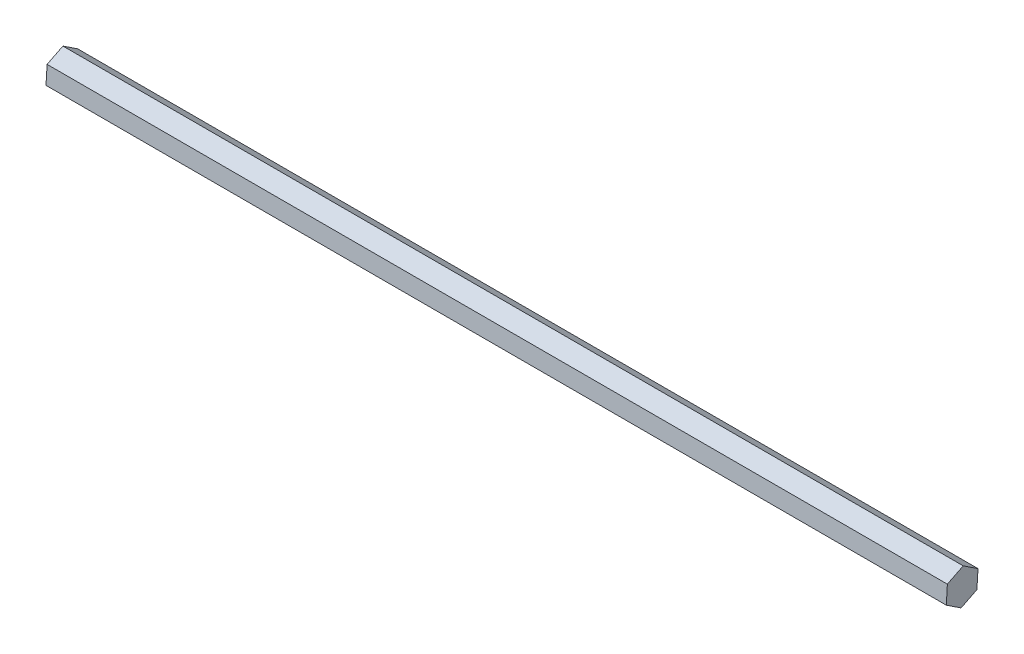
ISO-10303-21;
HEADER;
FILE_DESCRIPTION(('STEP AP214'),'2;1');
FILE_NAME('part.step','',(''),(''),'','','');
FILE_SCHEMA(('AUTOMOTIVE_DESIGN { 1 0 10303 214 1 1 1 1 }'));
ENDSEC;
DATA;
#1=APPLICATION_CONTEXT('core data for automotive mechanical design processes');
#2=APPLICATION_PROTOCOL_DEFINITION('international standard','automotive_design',2000,#1);
#3=PRODUCT_CONTEXT('',#1,'mechanical');
#4=PRODUCT('Part','Part','',(#3));
#5=PRODUCT_RELATED_PRODUCT_CATEGORY('part','',(#4));
#6=PRODUCT_DEFINITION_FORMATION('','',#4);
#7=PRODUCT_DEFINITION_CONTEXT('part definition',#1,'design');
#8=PRODUCT_DEFINITION('design','',#6,#7);
#9=PRODUCT_DEFINITION_SHAPE('','',#8);
#10=(LENGTH_UNIT() NAMED_UNIT(*) SI_UNIT(.MILLI.,.METRE.));
#11=(NAMED_UNIT(*) PLANE_ANGLE_UNIT() SI_UNIT($,.RADIAN.));
#12=(NAMED_UNIT(*) SI_UNIT($,.STERADIAN.) SOLID_ANGLE_UNIT());
#13=UNCERTAINTY_MEASURE_WITH_UNIT(LENGTH_MEASURE(1.E-05),#10,'distance_accuracy_value','');
#14=(GEOMETRIC_REPRESENTATION_CONTEXT(3) GLOBAL_UNCERTAINTY_ASSIGNED_CONTEXT((#13)) GLOBAL_UNIT_ASSIGNED_CONTEXT((#10,
#11,#12)) REPRESENTATION_CONTEXT('',''));
#15=CARTESIAN_POINT('',(0.,0.,0.));
#16=DIRECTION('',(0.,0.,1.));
#17=DIRECTION('',(1.,0.,0.));
#18=AXIS2_PLACEMENT_3D('',#15,#16,#17);
#19=CARTESIAN_POINT('',(381.,-7.48245422088217,0.457285098297222));
#20=DIRECTION('',(0.,0.894912889203078,0.44624087748457));
#21=DIRECTION('',(0.,-0.44624087748457,0.894912889203078));
#22=AXIS2_PLACEMENT_3D('',#19,#20,#21);
#23=PLANE('',#22);
#24=DIRECTION('',(0.,0.44624087748457,-0.894912889203078));
#25=VECTOR('',#24,1.);
#26=CARTESIAN_POINT('',(0.,-7.48245422088217,0.457285098297222));
#27=LINE('',#26,#25);
#28=CARTESIAN_POINT('',(0.,-7.48245422088217,0.457285098297222));
#29=VERTEX_POINT('',#28);
#30=CARTESIAN_POINT('',(0.,-4.13724762233855,-6.25135288878945));
#31=VERTEX_POINT('',#30);
#32=EDGE_CURVE('E117',#29,#31,#27,.T.);
#33=ORIENTED_EDGE('',*,*,#32,.T.);
#34=DIRECTION('',(-1.,0.,0.));
#35=VECTOR('',#34,1.);
#36=CARTESIAN_POINT('',(381.,-4.13724762233855,-6.25135288878945));
#37=LINE('',#36,#35);
#38=CARTESIAN_POINT('',(381.,-4.13724762233855,-6.25135288878945));
#39=VERTEX_POINT('',#38);
#40=EDGE_CURVE('E11',#39,#31,#37,.T.);
#41=ORIENTED_EDGE('',*,*,#40,.F.);
#42=DIRECTION('',(0.,0.44624087748457,-0.894912889203078));
#43=VECTOR('',#42,1.);
#44=CARTESIAN_POINT('',(381.,-7.48245422088217,0.457285098297222));
#45=LINE('',#44,#43);
#46=CARTESIAN_POINT('',(381.,-7.48245422088217,0.457285098297222));
#47=VERTEX_POINT('',#46);
#48=EDGE_CURVE('E127',#47,#39,#45,.T.);
#49=ORIENTED_EDGE('',*,*,#48,.F.);
#50=DIRECTION('',(-1.,0.,0.));
#51=VECTOR('',#50,1.);
#52=CARTESIAN_POINT('',(381.,-7.48245422088217,0.457285098297222));
#53=LINE('',#52,#51);
#54=EDGE_CURVE('E113',#47,#29,#53,.T.);
#55=ORIENTED_EDGE('',*,*,#54,.T.);
#56=EDGE_LOOP('',(#33,#41,#49,#55));
#57=FACE_BOUND('',#56,.T.);
#58=ADVANCED_FACE('F33',(#57),#23,.F.);
#59=CARTESIAN_POINT('',(381.,-4.13724762233855,-6.25135288878945));
#60=DIRECTION('',(0.,0.061000508492842,0.998137734966279));
#61=DIRECTION('',(0.,-0.998137734966279,0.061000508492842));
#62=AXIS2_PLACEMENT_3D('',#59,#60,#61);
#63=PLANE('',#62);
#64=DIRECTION('',(0.,0.998137734966279,-0.0610005084928419));
#65=VECTOR('',#64,1.);
#66=CARTESIAN_POINT('',(0.,-4.13724762233855,-6.25135288878945));
#67=LINE('',#66,#65);
#68=CARTESIAN_POINT('',(0.,3.34520659854363,-6.70863798708667));
#69=VERTEX_POINT('',#68);
#70=EDGE_CURVE('E120',#31,#69,#67,.T.);
#71=ORIENTED_EDGE('',*,*,#70,.T.);
#72=DIRECTION('',(-1.,0.,0.));
#73=VECTOR('',#72,1.);
#74=CARTESIAN_POINT('',(381.,3.34520659854363,-6.70863798708667));
#75=LINE('',#74,#73);
#76=CARTESIAN_POINT('',(381.,3.34520659854363,-6.70863798708667));
#77=VERTEX_POINT('',#76);
#78=EDGE_CURVE('E41',#77,#69,#75,.T.);
#79=ORIENTED_EDGE('',*,*,#78,.F.);
#80=DIRECTION('',(0.,0.998137734966279,-0.0610005084928419));
#81=VECTOR('',#80,1.);
#82=CARTESIAN_POINT('',(381.,-4.13724762233855,-6.25135288878945));
#83=LINE('',#82,#81);
#84=EDGE_CURVE('E86',#39,#77,#83,.T.);
#85=ORIENTED_EDGE('',*,*,#84,.F.);
#86=ORIENTED_EDGE('',*,*,#40,.T.);
#87=EDGE_LOOP('',(#71,#79,#85,#86));
#88=FACE_BOUND('',#87,.T.);
#89=ADVANCED_FACE('F151',(#88),#63,.F.);
#90=CARTESIAN_POINT('',(381.,3.34520659854363,-6.70863798708667));
#91=DIRECTION('',(0.,-0.833912380710236,0.551896857481709));
#92=DIRECTION('',(0.,-0.551896857481709,-0.833912380710236));
#93=AXIS2_PLACEMENT_3D('',#90,#91,#92);
#94=PLANE('',#93);
#95=DIRECTION('',(0.,0.551896857481709,0.833912380710236));
#96=VECTOR('',#95,1.);
#97=CARTESIAN_POINT('',(0.,3.34520659854363,-6.70863798708667));
#98=LINE('',#97,#96);
#99=CARTESIAN_POINT('',(0.,7.48245422088217,-0.457285098297227));
#100=VERTEX_POINT('',#99);
#101=EDGE_CURVE('E122',#69,#100,#98,.T.);
#102=ORIENTED_EDGE('',*,*,#101,.T.);
#103=DIRECTION('',(-1.,0.,0.));
#104=VECTOR('',#103,1.);
#105=CARTESIAN_POINT('',(381.,7.48245422088217,-0.457285098297227));
#106=LINE('',#105,#104);
#107=CARTESIAN_POINT('',(381.,7.48245422088217,-0.457285098297227));
#108=VERTEX_POINT('',#107);
#109=EDGE_CURVE('E108',#108,#100,#106,.T.);
#110=ORIENTED_EDGE('',*,*,#109,.F.);
#111=DIRECTION('',(0.,0.551896857481709,0.833912380710236));
#112=VECTOR('',#111,1.);
#113=CARTESIAN_POINT('',(381.,3.34520659854363,-6.70863798708667));
#114=LINE('',#113,#112);
#115=EDGE_CURVE('E99',#77,#108,#114,.T.);
#116=ORIENTED_EDGE('',*,*,#115,.F.);
#117=ORIENTED_EDGE('',*,*,#78,.T.);
#118=EDGE_LOOP('',(#102,#110,#116,#117));
#119=FACE_BOUND('',#118,.T.);
#120=ADVANCED_FACE('F133',(#119),#94,.F.);
#121=CARTESIAN_POINT('',(381.,7.48245422088217,-0.457285098297227));
#122=DIRECTION('',(0.,-0.894912889203078,-0.44624087748457));
#123=DIRECTION('',(0.,0.44624087748457,-0.894912889203078));
#124=AXIS2_PLACEMENT_3D('',#121,#122,#123);
#125=PLANE('',#124);
#126=DIRECTION('',(0.,-0.44624087748457,0.894912889203078));
#127=VECTOR('',#126,1.);
#128=CARTESIAN_POINT('',(0.,7.48245422088217,-0.457285098297227));
#129=LINE('',#128,#127);
#130=CARTESIAN_POINT('',(0.,4.13724762233855,6.25135288878945));
#131=VERTEX_POINT('',#130);
#132=EDGE_CURVE('E107',#100,#131,#129,.T.);
#133=ORIENTED_EDGE('',*,*,#132,.T.);
#134=DIRECTION('',(-1.,0.,0.));
#135=VECTOR('',#134,1.);
#136=CARTESIAN_POINT('',(381.,4.13724762233855,6.25135288878945));
#137=LINE('',#136,#135);
#138=CARTESIAN_POINT('',(381.,4.13724762233855,6.25135288878945));
#139=VERTEX_POINT('',#138);
#140=EDGE_CURVE('E104',#139,#131,#137,.T.);
#141=ORIENTED_EDGE('',*,*,#140,.F.);
#142=DIRECTION('',(0.,-0.44624087748457,0.894912889203078));
#143=VECTOR('',#142,1.);
#144=CARTESIAN_POINT('',(381.,7.48245422088217,-0.457285098297227));
#145=LINE('',#144,#143);
#146=EDGE_CURVE('E93',#108,#139,#145,.T.);
#147=ORIENTED_EDGE('',*,*,#146,.F.);
#148=ORIENTED_EDGE('',*,*,#109,.T.);
#149=EDGE_LOOP('',(#133,#141,#147,#148));
#150=FACE_BOUND('',#149,.T.);
#151=ADVANCED_FACE('F105',(#150),#125,.F.);
#152=CARTESIAN_POINT('',(381.,4.13724762233855,6.25135288878945));
#153=DIRECTION('',(0.,-0.0610005084928421,-0.998137734966279));
#154=DIRECTION('',(0.,0.998137734966279,-0.0610005084928421));
#155=AXIS2_PLACEMENT_3D('',#152,#153,#154);
#156=PLANE('',#155);
#157=DIRECTION('',(0.,-0.998137734966279,0.0610005084928421));
#158=VECTOR('',#157,1.);
#159=CARTESIAN_POINT('',(0.,4.13724762233855,6.25135288878945));
#160=LINE('',#159,#158);
#161=CARTESIAN_POINT('',(0.,-3.34520659854362,6.70863798708667));
#162=VERTEX_POINT('',#161);
#163=EDGE_CURVE('E72',#131,#162,#160,.T.);
#164=ORIENTED_EDGE('',*,*,#163,.T.);
#165=DIRECTION('',(-1.,0.,0.));
#166=VECTOR('',#165,1.);
#167=CARTESIAN_POINT('',(381.,-3.34520659854362,6.70863798708667));
#168=LINE('',#167,#166);
#169=CARTESIAN_POINT('',(381.,-3.34520659854362,6.70863798708667));
#170=VERTEX_POINT('',#169);
#171=EDGE_CURVE('E109',#170,#162,#168,.T.);
#172=ORIENTED_EDGE('',*,*,#171,.F.);
#173=DIRECTION('',(0.,-0.998137734966279,0.0610005084928421));
#174=VECTOR('',#173,1.);
#175=CARTESIAN_POINT('',(381.,4.13724762233855,6.25135288878945));
#176=LINE('',#175,#174);
#177=EDGE_CURVE('E97',#139,#170,#176,.T.);
#178=ORIENTED_EDGE('',*,*,#177,.F.);
#179=ORIENTED_EDGE('',*,*,#140,.T.);
#180=EDGE_LOOP('',(#164,#172,#178,#179));
#181=FACE_BOUND('',#180,.T.);
#182=ADVANCED_FACE('F111',(#181),#156,.F.);
#183=CARTESIAN_POINT('',(381.,-3.34520659854362,6.70863798708667));
#184=DIRECTION('',(0.,0.833912380710236,-0.551896857481709));
#185=DIRECTION('',(0.,0.551896857481709,0.833912380710236));
#186=AXIS2_PLACEMENT_3D('',#183,#184,#185);
#187=PLANE('',#186);
#188=DIRECTION('',(0.,-0.551896857481709,-0.833912380710236));
#189=VECTOR('',#188,1.);
#190=CARTESIAN_POINT('',(0.,-3.34520659854362,6.70863798708667));
#191=LINE('',#190,#189);
#192=EDGE_CURVE('E78',#162,#29,#191,.T.);
#193=ORIENTED_EDGE('',*,*,#192,.T.);
#194=ORIENTED_EDGE('',*,*,#54,.F.);
#195=DIRECTION('',(0.,-0.551896857481709,-0.833912380710236));
#196=VECTOR('',#195,1.);
#197=CARTESIAN_POINT('',(381.,-3.34520659854362,6.70863798708667));
#198=LINE('',#197,#196);
#199=EDGE_CURVE('E49',#170,#47,#198,.T.);
#200=ORIENTED_EDGE('',*,*,#199,.F.);
#201=ORIENTED_EDGE('',*,*,#171,.T.);
#202=EDGE_LOOP('',(#193,#194,#200,#201));
#203=FACE_BOUND('',#202,.T.);
#204=ADVANCED_FACE('F140',(#203),#187,.F.);
#205=CARTESIAN_POINT('',(381.,0.,0.));
#206=DIRECTION('',(1.,0.,0.));
#207=DIRECTION('',(0.,0.,-1.));
#208=AXIS2_PLACEMENT_3D('',#205,#206,#207);
#209=PLANE('',#208);
#210=ORIENTED_EDGE('',*,*,#48,.T.);
#211=ORIENTED_EDGE('',*,*,#84,.T.);
#212=ORIENTED_EDGE('',*,*,#115,.T.);
#213=ORIENTED_EDGE('',*,*,#146,.T.);
#214=ORIENTED_EDGE('',*,*,#177,.T.);
#215=ORIENTED_EDGE('',*,*,#199,.T.);
#216=EDGE_LOOP('',(#210,#211,#212,#213,#214,#215));
#217=FACE_BOUND('',#216,.T.);
#218=ADVANCED_FACE('F95',(#217),#209,.T.);
#219=CARTESIAN_POINT('',(0.,0.,0.));
#220=DIRECTION('',(1.,0.,0.));
#221=DIRECTION('',(0.,0.,-1.));
#222=AXIS2_PLACEMENT_3D('',#219,#220,#221);
#223=PLANE('',#222);
#224=ORIENTED_EDGE('',*,*,#32,.F.);
#225=ORIENTED_EDGE('',*,*,#192,.F.);
#226=ORIENTED_EDGE('',*,*,#163,.F.);
#227=ORIENTED_EDGE('',*,*,#132,.F.);
#228=ORIENTED_EDGE('',*,*,#101,.F.);
#229=ORIENTED_EDGE('',*,*,#70,.F.);
#230=EDGE_LOOP('',(#224,#225,#226,#227,#228,#229));
#231=FACE_BOUND('',#230,.T.);
#232=ADVANCED_FACE('F136',(#231),#223,.F.);
#233=CLOSED_SHELL('',(#58,#89,#120,#151,#182,#204,#218,#232));
#234=MANIFOLD_SOLID_BREP('B2',#233);
#235=ADVANCED_BREP_SHAPE_REPRESENTATION('',(#18,#234),#14);
#236=SHAPE_DEFINITION_REPRESENTATION(#9,#235);
ENDSEC;
END-ISO-10303-21;
